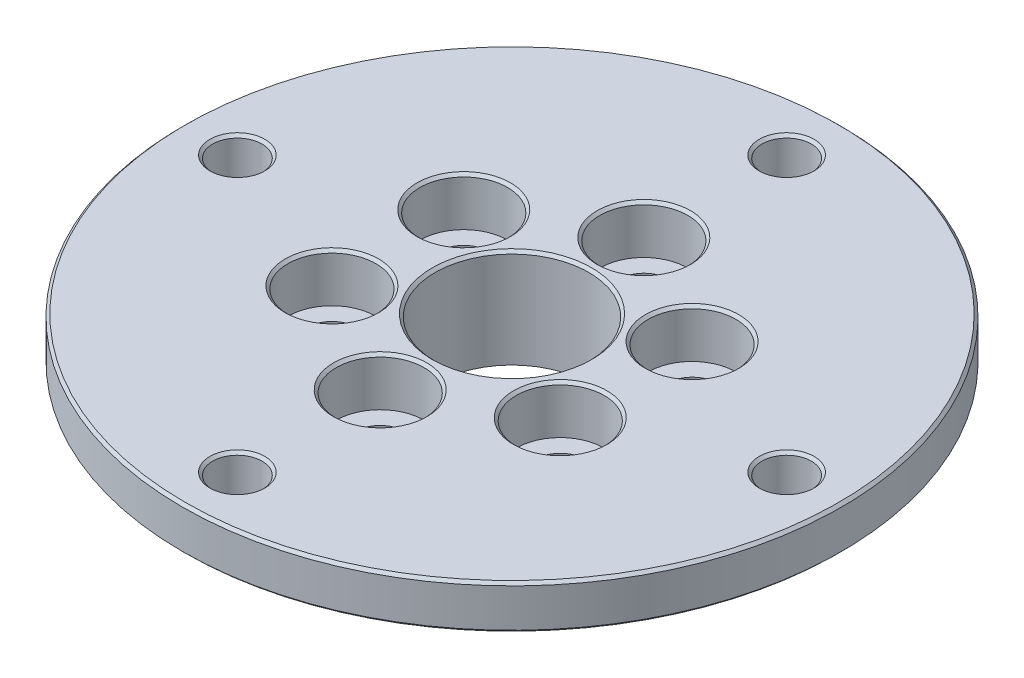
ISO-10303-21;
HEADER;
FILE_DESCRIPTION(('STEP AP214'),'2;1');
FILE_NAME('part.step','',(''),(''),'','','');
FILE_SCHEMA(('AUTOMOTIVE_DESIGN { 1 0 10303 214 1 1 1 1 }'));
ENDSEC;
DATA;
#1=APPLICATION_CONTEXT('core data for automotive mechanical design processes');
#2=APPLICATION_PROTOCOL_DEFINITION('international standard','automotive_design',2000,#1);
#3=PRODUCT_CONTEXT('',#1,'mechanical');
#4=PRODUCT('Part','Part','',(#3));
#5=PRODUCT_RELATED_PRODUCT_CATEGORY('part','',(#4));
#6=PRODUCT_DEFINITION_FORMATION('','',#4);
#7=PRODUCT_DEFINITION_CONTEXT('part definition',#1,'design');
#8=PRODUCT_DEFINITION('design','',#6,#7);
#9=PRODUCT_DEFINITION_SHAPE('','',#8);
#10=(LENGTH_UNIT() NAMED_UNIT(*) SI_UNIT(.MILLI.,.METRE.));
#11=(NAMED_UNIT(*) PLANE_ANGLE_UNIT() SI_UNIT($,.RADIAN.));
#12=(NAMED_UNIT(*) SI_UNIT($,.STERADIAN.) SOLID_ANGLE_UNIT());
#13=UNCERTAINTY_MEASURE_WITH_UNIT(LENGTH_MEASURE(1.E-05),#10,'distance_accuracy_value','');
#14=(GEOMETRIC_REPRESENTATION_CONTEXT(3) GLOBAL_UNCERTAINTY_ASSIGNED_CONTEXT((#13)) GLOBAL_UNIT_ASSIGNED_CONTEXT((#10,
#11,#12)) REPRESENTATION_CONTEXT('',''));
#15=CARTESIAN_POINT('',(0.,0.,0.));
#16=DIRECTION('',(0.,0.,1.));
#17=DIRECTION('',(1.,0.,0.));
#18=AXIS2_PLACEMENT_3D('',#15,#16,#17);
#19=CARTESIAN_POINT('',(0.,0.,0.));
#20=DIRECTION('',(0.,1.,0.));
#21=DIRECTION('',(0.,0.,1.));
#22=AXIS2_PLACEMENT_3D('',#19,#20,#21);
#23=PLANE('',#22);
#24=CARTESIAN_POINT('',(0.,0.,-12.));
#25=DIRECTION('',(0.,1.,0.));
#26=DIRECTION('',(0.,0.,1.));
#27=AXIS2_PLACEMENT_3D('',#24,#25,#26);
#28=CIRCLE('',#27,2.25);
#29=CARTESIAN_POINT('',(0.,0.,-9.75));
#30=VERTEX_POINT('',#29);
#31=EDGE_CURVE('E207',#30,#30,#28,.T.);
#32=ORIENTED_EDGE('',*,*,#31,.T.);
#33=EDGE_LOOP('',(#32));
#34=FACE_BOUND('',#33,.T.);
#35=CARTESIAN_POINT('',(10.3923048454133,0.,-5.99999999999998));
#36=DIRECTION('',(0.,1.,0.));
#37=DIRECTION('',(0.,0.,1.));
#38=AXIS2_PLACEMENT_3D('',#35,#36,#37);
#39=CIRCLE('',#38,2.25);
#40=CARTESIAN_POINT('',(10.3923048454133,0.,-3.74999999999998));
#41=VERTEX_POINT('',#40);
#42=EDGE_CURVE('E198',#41,#41,#39,.T.);
#43=ORIENTED_EDGE('',*,*,#42,.T.);
#44=EDGE_LOOP('',(#43));
#45=FACE_BOUND('',#44,.T.);
#46=CARTESIAN_POINT('',(10.3923048454132,0.,6.00000000000005));
#47=DIRECTION('',(0.,1.,0.));
#48=DIRECTION('',(0.,0.,1.));
#49=AXIS2_PLACEMENT_3D('',#46,#47,#48);
#50=CIRCLE('',#49,2.25);
#51=CARTESIAN_POINT('',(10.3923048454132,0.,8.25000000000005));
#52=VERTEX_POINT('',#51);
#53=EDGE_CURVE('E189',#52,#52,#50,.T.);
#54=ORIENTED_EDGE('',*,*,#53,.T.);
#55=EDGE_LOOP('',(#54));
#56=FACE_BOUND('',#55,.T.);
#57=CARTESIAN_POINT('',(0.,0.,12.));
#58=DIRECTION('',(0.,1.,0.));
#59=DIRECTION('',(0.,0.,1.));
#60=AXIS2_PLACEMENT_3D('',#57,#58,#59);
#61=CIRCLE('',#60,2.25);
#62=CARTESIAN_POINT('',(0.,0.,14.25));
#63=VERTEX_POINT('',#62);
#64=EDGE_CURVE('E180',#63,#63,#61,.T.);
#65=ORIENTED_EDGE('',*,*,#64,.T.);
#66=EDGE_LOOP('',(#65));
#67=FACE_BOUND('',#66,.T.);
#68=CARTESIAN_POINT('',(-10.3923048454133,0.,5.99999999999991));
#69=DIRECTION('',(0.,1.,0.));
#70=DIRECTION('',(0.,0.,1.));
#71=AXIS2_PLACEMENT_3D('',#68,#69,#70);
#72=CIRCLE('',#71,2.25);
#73=CARTESIAN_POINT('',(-10.3923048454133,0.,8.24999999999991));
#74=VERTEX_POINT('',#73);
#75=EDGE_CURVE('E171',#74,#74,#72,.T.);
#76=ORIENTED_EDGE('',*,*,#75,.T.);
#77=EDGE_LOOP('',(#76));
#78=FACE_BOUND('',#77,.T.);
#79=CARTESIAN_POINT('',(-10.3923048454132,0.,-6.00000000000012));
#80=DIRECTION('',(0.,1.,0.));
#81=DIRECTION('',(0.,0.,1.));
#82=AXIS2_PLACEMENT_3D('',#79,#80,#81);
#83=CIRCLE('',#82,2.25);
#84=CARTESIAN_POINT('',(-10.3923048454132,0.,-3.75000000000012));
#85=VERTEX_POINT('',#84);
#86=EDGE_CURVE('E162',#85,#85,#83,.T.);
#87=ORIENTED_EDGE('',*,*,#86,.T.);
#88=EDGE_LOOP('',(#87));
#89=FACE_BOUND('',#88,.T.);
#90=CARTESIAN_POINT('',(0.,0.,0.));
#91=DIRECTION('',(0.,1.,0.));
#92=DIRECTION('',(0.,0.,1.));
#93=AXIS2_PLACEMENT_3D('',#90,#91,#92);
#94=CIRCLE('',#93,20.5);
#95=CARTESIAN_POINT('',(0.,0.,20.5));
#96=VERTEX_POINT('',#95);
#97=EDGE_CURVE('E156',#96,#96,#94,.T.);
#98=ORIENTED_EDGE('',*,*,#97,.F.);
#99=EDGE_LOOP('',(#98));
#100=FACE_BOUND('',#99,.T.);
#101=CARTESIAN_POINT('',(0.,0.,0.));
#102=DIRECTION('',(0.,1.,0.));
#103=DIRECTION('',(0.,0.,1.));
#104=AXIS2_PLACEMENT_3D('',#101,#102,#103);
#105=CIRCLE('',#104,7.);
#106=CARTESIAN_POINT('',(0.,0.,7.));
#107=VERTEX_POINT('',#106);
#108=EDGE_CURVE('E159',#107,#107,#105,.T.);
#109=ORIENTED_EDGE('',*,*,#108,.T.);
#110=EDGE_LOOP('',(#109));
#111=FACE_BOUND('',#110,.T.);
#112=ADVANCED_FACE('F39',(#34,#45,#56,#67,#78,#89,#100,#111),#23,.F.);
#113=CARTESIAN_POINT('',(0.,5.,0.));
#114=DIRECTION('',(0.,-1.,0.));
#115=DIRECTION('',(0.,0.,-1.));
#116=AXIS2_PLACEMENT_3D('',#113,#114,#115);
#117=CYLINDRICAL_SURFACE('',#116,20.5);
#118=CARTESIAN_POINT('',(0.,4.75,0.));
#119=DIRECTION('',(0.,1.,0.));
#120=DIRECTION('',(0.,0.,1.));
#121=AXIS2_PLACEMENT_3D('',#118,#119,#120);
#122=CIRCLE('',#121,20.5);
#123=CARTESIAN_POINT('',(0.,4.75,20.5));
#124=VERTEX_POINT('',#123);
#125=EDGE_CURVE('E10',#124,#124,#122,.F.);
#126=ORIENTED_EDGE('',*,*,#125,.T.);
#127=EDGE_LOOP('',(#126));
#128=FACE_BOUND('',#127,.T.);
#129=ORIENTED_EDGE('',*,*,#97,.T.);
#130=EDGE_LOOP('',(#129));
#131=FACE_BOUND('',#130,.T.);
#132=ADVANCED_FACE('F236',(#128,#131),#117,.T.);
#133=CARTESIAN_POINT('',(0.,5.,0.));
#134=DIRECTION('',(0.,-1.,0.));
#135=DIRECTION('',(0.,0.,-1.));
#136=AXIS2_PLACEMENT_3D('',#133,#134,#135);
#137=CYLINDRICAL_SURFACE('',#136,7.);
#138=CARTESIAN_POINT('',(0.,8.74999999999998,0.));
#139=DIRECTION('',(0.,1.,0.));
#140=DIRECTION('',(0.,0.,1.));
#141=AXIS2_PLACEMENT_3D('',#138,#139,#140);
#142=CIRCLE('',#141,7.);
#143=CARTESIAN_POINT('',(0.,8.74999999999998,7.));
#144=VERTEX_POINT('',#143);
#145=EDGE_CURVE('E55',#144,#144,#142,.T.);
#146=ORIENTED_EDGE('',*,*,#145,.T.);
#147=EDGE_LOOP('',(#146));
#148=FACE_BOUND('',#147,.T.);
#149=ORIENTED_EDGE('',*,*,#108,.F.);
#150=EDGE_LOOP('',(#149));
#151=FACE_BOUND('',#150,.T.);
#152=ADVANCED_FACE('F243',(#148,#151),#137,.F.);
#153=CARTESIAN_POINT('',(0.,9.,0.));
#154=DIRECTION('',(0.,1.,0.));
#155=DIRECTION('',(0.,0.,1.));
#156=AXIS2_PLACEMENT_3D('',#153,#154,#155);
#157=PLANE('',#156);
#158=CARTESIAN_POINT('',(0.,9.,-12.));
#159=DIRECTION('',(0.,1.,0.));
#160=DIRECTION('',(0.,0.,1.));
#161=AXIS2_PLACEMENT_3D('',#158,#159,#160);
#162=CIRCLE('',#161,4.25000000000001);
#163=CARTESIAN_POINT('',(0.,9.,-7.74999999999999));
#164=VERTEX_POINT('',#163);
#165=EDGE_CURVE('E117',#164,#164,#162,.F.);
#166=ORIENTED_EDGE('',*,*,#165,.T.);
#167=EDGE_LOOP('',(#166));
#168=FACE_BOUND('',#167,.T.);
#169=CARTESIAN_POINT('',(10.3923048454133,9.,-5.99999999999998));
#170=DIRECTION('',(0.,1.,0.));
#171=DIRECTION('',(0.,0.,1.));
#172=AXIS2_PLACEMENT_3D('',#169,#170,#171);
#173=CIRCLE('',#172,4.25000000000001);
#174=CARTESIAN_POINT('',(10.3923048454133,9.,-1.74999999999996));
#175=VERTEX_POINT('',#174);
#176=EDGE_CURVE('E120',#175,#175,#173,.F.);
#177=ORIENTED_EDGE('',*,*,#176,.T.);
#178=EDGE_LOOP('',(#177));
#179=FACE_BOUND('',#178,.T.);
#180=CARTESIAN_POINT('',(10.3923048454132,9.,6.00000000000005));
#181=DIRECTION('',(0.,1.,0.));
#182=DIRECTION('',(0.,0.,1.));
#183=AXIS2_PLACEMENT_3D('',#180,#181,#182);
#184=CIRCLE('',#183,4.25000000000001);
#185=CARTESIAN_POINT('',(10.3923048454132,9.,10.2500000000001));
#186=VERTEX_POINT('',#185);
#187=EDGE_CURVE('E123',#186,#186,#184,.F.);
#188=ORIENTED_EDGE('',*,*,#187,.T.);
#189=EDGE_LOOP('',(#188));
#190=FACE_BOUND('',#189,.T.);
#191=CARTESIAN_POINT('',(0.,9.,12.));
#192=DIRECTION('',(0.,1.,0.));
#193=DIRECTION('',(0.,0.,1.));
#194=AXIS2_PLACEMENT_3D('',#191,#192,#193);
#195=CIRCLE('',#194,4.24999999999999);
#196=CARTESIAN_POINT('',(0.,9.,16.25));
#197=VERTEX_POINT('',#196);
#198=EDGE_CURVE('E126',#197,#197,#195,.F.);
#199=ORIENTED_EDGE('',*,*,#198,.T.);
#200=EDGE_LOOP('',(#199));
#201=FACE_BOUND('',#200,.T.);
#202=CARTESIAN_POINT('',(-10.3923048454133,9.,5.99999999999991));
#203=DIRECTION('',(0.,1.,0.));
#204=DIRECTION('',(0.,0.,1.));
#205=AXIS2_PLACEMENT_3D('',#202,#203,#204);
#206=CIRCLE('',#205,4.25);
#207=CARTESIAN_POINT('',(-10.3923048454133,9.,10.2499999999999));
#208=VERTEX_POINT('',#207);
#209=EDGE_CURVE('E129',#208,#208,#206,.F.);
#210=ORIENTED_EDGE('',*,*,#209,.T.);
#211=EDGE_LOOP('',(#210));
#212=FACE_BOUND('',#211,.T.);
#213=CARTESIAN_POINT('',(-10.3923048454132,9.,-6.00000000000012));
#214=DIRECTION('',(0.,1.,0.));
#215=DIRECTION('',(0.,0.,1.));
#216=AXIS2_PLACEMENT_3D('',#213,#214,#215);
#217=CIRCLE('',#216,4.25000000000001);
#218=CARTESIAN_POINT('',(-10.3923048454132,9.,-1.75000000000011));
#219=VERTEX_POINT('',#218);
#220=EDGE_CURVE('E132',#219,#219,#217,.F.);
#221=ORIENTED_EDGE('',*,*,#220,.T.);
#222=EDGE_LOOP('',(#221));
#223=FACE_BOUND('',#222,.T.);
#224=CARTESIAN_POINT('',(0.,9.,-25.));
#225=DIRECTION('',(0.,1.,0.));
#226=DIRECTION('',(0.,0.,1.));
#227=AXIS2_PLACEMENT_3D('',#224,#225,#226);
#228=CIRCLE('',#227,2.5);
#229=CARTESIAN_POINT('',(0.,9.,-22.5));
#230=VERTEX_POINT('',#229);
#231=EDGE_CURVE('E135',#230,#230,#228,.F.);
#232=ORIENTED_EDGE('',*,*,#231,.T.);
#233=EDGE_LOOP('',(#232));
#234=FACE_BOUND('',#233,.T.);
#235=CARTESIAN_POINT('',(25.,9.,0.));
#236=DIRECTION('',(0.,1.,0.));
#237=DIRECTION('',(0.,0.,1.));
#238=AXIS2_PLACEMENT_3D('',#235,#236,#237);
#239=CIRCLE('',#238,2.49999999999999);
#240=CARTESIAN_POINT('',(25.,9.,2.49999999999999));
#241=VERTEX_POINT('',#240);
#242=EDGE_CURVE('E138',#241,#241,#239,.F.);
#243=ORIENTED_EDGE('',*,*,#242,.T.);
#244=EDGE_LOOP('',(#243));
#245=FACE_BOUND('',#244,.T.);
#246=CARTESIAN_POINT('',(0.,9.,25.));
#247=DIRECTION('',(0.,1.,0.));
#248=DIRECTION('',(0.,0.,1.));
#249=AXIS2_PLACEMENT_3D('',#246,#247,#248);
#250=CIRCLE('',#249,2.5);
#251=CARTESIAN_POINT('',(0.,9.,27.5));
#252=VERTEX_POINT('',#251);
#253=EDGE_CURVE('E141',#252,#252,#250,.F.);
#254=ORIENTED_EDGE('',*,*,#253,.T.);
#255=EDGE_LOOP('',(#254));
#256=FACE_BOUND('',#255,.T.);
#257=CARTESIAN_POINT('',(-25.,9.,0.));
#258=DIRECTION('',(0.,1.,0.));
#259=DIRECTION('',(0.,0.,1.));
#260=AXIS2_PLACEMENT_3D('',#257,#258,#259);
#261=CIRCLE('',#260,2.49999999999999);
#262=CARTESIAN_POINT('',(-25.,9.,2.49999999999999));
#263=VERTEX_POINT('',#262);
#264=EDGE_CURVE('E144',#263,#263,#261,.F.);
#265=ORIENTED_EDGE('',*,*,#264,.T.);
#266=EDGE_LOOP('',(#265));
#267=FACE_BOUND('',#266,.T.);
#268=CARTESIAN_POINT('',(0.,9.,0.));
#269=DIRECTION('',(0.,1.,0.));
#270=DIRECTION('',(0.,0.,1.));
#271=AXIS2_PLACEMENT_3D('',#268,#269,#270);
#272=CIRCLE('',#271,7.25000000000001);
#273=CARTESIAN_POINT('',(0.,9.,7.25000000000001));
#274=VERTEX_POINT('',#273);
#275=EDGE_CURVE('E147',#274,#274,#272,.F.);
#276=ORIENTED_EDGE('',*,*,#275,.T.);
#277=EDGE_LOOP('',(#276));
#278=FACE_BOUND('',#277,.T.);
#279=CARTESIAN_POINT('',(0.,9.,0.));
#280=DIRECTION('',(0.,1.,0.));
#281=DIRECTION('',(0.,0.,1.));
#282=AXIS2_PLACEMENT_3D('',#279,#280,#281);
#283=CIRCLE('',#282,29.75);
#284=CARTESIAN_POINT('',(0.,9.,29.75));
#285=VERTEX_POINT('',#284);
#286=EDGE_CURVE('E150',#285,#285,#283,.T.);
#287=ORIENTED_EDGE('',*,*,#286,.T.);
#288=EDGE_LOOP('',(#287));
#289=FACE_BOUND('',#288,.T.);
#290=ADVANCED_FACE('F371',(#168,#179,#190,#201,#212,#223,#234,#245,#256,#267,#278,#289),#157,.T.);
#291=CARTESIAN_POINT('',(0.,5.,0.));
#292=DIRECTION('',(0.,1.,0.));
#293=DIRECTION('',(0.,0.,1.));
#294=AXIS2_PLACEMENT_3D('',#291,#292,#293);
#295=PLANE('',#294);
#296=CARTESIAN_POINT('',(0.,5.,-25.));
#297=DIRECTION('',(0.,1.,0.));
#298=DIRECTION('',(0.,0.,1.));
#299=AXIS2_PLACEMENT_3D('',#296,#297,#298);
#300=CIRCLE('',#299,2.50000000000001);
#301=CARTESIAN_POINT('',(0.,5.,-22.5));
#302=VERTEX_POINT('',#301);
#303=EDGE_CURVE('E78',#302,#302,#300,.T.);
#304=ORIENTED_EDGE('',*,*,#303,.T.);
#305=EDGE_LOOP('',(#304));
#306=FACE_BOUND('',#305,.T.);
#307=CARTESIAN_POINT('',(25.,5.,0.));
#308=DIRECTION('',(0.,1.,0.));
#309=DIRECTION('',(0.,0.,1.));
#310=AXIS2_PLACEMENT_3D('',#307,#308,#309);
#311=CIRCLE('',#310,2.50000000000001);
#312=CARTESIAN_POINT('',(25.,5.,2.50000000000001));
#313=VERTEX_POINT('',#312);
#314=EDGE_CURVE('E81',#313,#313,#311,.T.);
#315=ORIENTED_EDGE('',*,*,#314,.T.);
#316=EDGE_LOOP('',(#315));
#317=FACE_BOUND('',#316,.T.);
#318=CARTESIAN_POINT('',(0.,5.,25.));
#319=DIRECTION('',(0.,1.,0.));
#320=DIRECTION('',(0.,0.,1.));
#321=AXIS2_PLACEMENT_3D('',#318,#319,#320);
#322=CIRCLE('',#321,2.50000000000001);
#323=CARTESIAN_POINT('',(0.,5.,27.5));
#324=VERTEX_POINT('',#323);
#325=EDGE_CURVE('E84',#324,#324,#322,.T.);
#326=ORIENTED_EDGE('',*,*,#325,.T.);
#327=EDGE_LOOP('',(#326));
#328=FACE_BOUND('',#327,.T.);
#329=CARTESIAN_POINT('',(-25.,5.,0.));
#330=DIRECTION('',(0.,1.,0.));
#331=DIRECTION('',(0.,0.,1.));
#332=AXIS2_PLACEMENT_3D('',#329,#330,#331);
#333=CIRCLE('',#332,2.50000000000001);
#334=CARTESIAN_POINT('',(-25.,5.,2.50000000000001));
#335=VERTEX_POINT('',#334);
#336=EDGE_CURVE('E87',#335,#335,#333,.T.);
#337=ORIENTED_EDGE('',*,*,#336,.T.);
#338=EDGE_LOOP('',(#337));
#339=FACE_BOUND('',#338,.T.);
#340=CARTESIAN_POINT('',(0.,5.,0.));
#341=DIRECTION('',(0.,1.,0.));
#342=DIRECTION('',(0.,0.,1.));
#343=AXIS2_PLACEMENT_3D('',#340,#341,#342);
#344=CIRCLE('',#343,29.75);
#345=CARTESIAN_POINT('',(0.,5.,29.75));
#346=VERTEX_POINT('',#345);
#347=EDGE_CURVE('E90',#346,#346,#344,.F.);
#348=ORIENTED_EDGE('',*,*,#347,.T.);
#349=EDGE_LOOP('',(#348));
#350=FACE_BOUND('',#349,.T.);
#351=CARTESIAN_POINT('',(0.,5.,0.));
#352=DIRECTION('',(0.,1.,0.));
#353=DIRECTION('',(0.,0.,1.));
#354=AXIS2_PLACEMENT_3D('',#351,#352,#353);
#355=CIRCLE('',#354,20.75);
#356=CARTESIAN_POINT('',(0.,5.,20.75));
#357=VERTEX_POINT('',#356);
#358=EDGE_CURVE('E93',#357,#357,#355,.T.);
#359=ORIENTED_EDGE('',*,*,#358,.T.);
#360=EDGE_LOOP('',(#359));
#361=FACE_BOUND('',#360,.T.);
#362=ADVANCED_FACE('F368',(#306,#317,#328,#339,#350,#361),#295,.F.);
#363=CARTESIAN_POINT('',(0.,9.,0.));
#364=DIRECTION('',(0.,-1.,0.));
#365=DIRECTION('',(0.,0.,-1.));
#366=AXIS2_PLACEMENT_3D('',#363,#364,#365);
#367=CYLINDRICAL_SURFACE('',#366,30.);
#368=CARTESIAN_POINT('',(0.,5.25,0.));
#369=DIRECTION('',(0.,1.,0.));
#370=DIRECTION('',(0.,0.,1.));
#371=AXIS2_PLACEMENT_3D('',#368,#369,#370);
#372=CIRCLE('',#371,30.);
#373=CARTESIAN_POINT('',(0.,5.25,30.));
#374=VERTEX_POINT('',#373);
#375=EDGE_CURVE('E47',#374,#374,#372,.T.);
#376=ORIENTED_EDGE('',*,*,#375,.T.);
#377=EDGE_LOOP('',(#376));
#378=FACE_BOUND('',#377,.T.);
#379=CARTESIAN_POINT('',(0.,8.75,0.));
#380=DIRECTION('',(0.,1.,0.));
#381=DIRECTION('',(0.,0.,1.));
#382=AXIS2_PLACEMENT_3D('',#379,#380,#381);
#383=CIRCLE('',#382,30.);
#384=CARTESIAN_POINT('',(0.,8.75,30.));
#385=VERTEX_POINT('',#384);
#386=EDGE_CURVE('E51',#385,#385,#383,.F.);
#387=ORIENTED_EDGE('',*,*,#386,.T.);
#388=EDGE_LOOP('',(#387));
#389=FACE_BOUND('',#388,.T.);
#390=ADVANCED_FACE('F370',(#378,#389),#367,.T.);
#391=CARTESIAN_POINT('',(-25.,5.,0.));
#392=DIRECTION('',(0.,-1.,0.));
#393=DIRECTION('',(0.,0.,-1.));
#394=AXIS2_PLACEMENT_3D('',#391,#392,#393);
#395=CYLINDRICAL_SURFACE('',#394,2.25);
#396=CARTESIAN_POINT('',(-25.,5.25,0.));
#397=DIRECTION('',(0.,1.,0.));
#398=DIRECTION('',(0.,0.,1.));
#399=AXIS2_PLACEMENT_3D('',#396,#397,#398);
#400=CIRCLE('',#399,2.25);
#401=CARTESIAN_POINT('',(-25.,5.25,2.25));
#402=VERTEX_POINT('',#401);
#403=EDGE_CURVE('E60',#402,#402,#400,.F.);
#404=ORIENTED_EDGE('',*,*,#403,.T.);
#405=EDGE_LOOP('',(#404));
#406=FACE_BOUND('',#405,.T.);
#407=CARTESIAN_POINT('',(-25.,8.75000000000001,0.));
#408=DIRECTION('',(0.,1.,0.));
#409=DIRECTION('',(0.,0.,1.));
#410=AXIS2_PLACEMENT_3D('',#407,#408,#409);
#411=CIRCLE('',#410,2.25);
#412=CARTESIAN_POINT('',(-25.,8.75000000000001,2.25));
#413=VERTEX_POINT('',#412);
#414=EDGE_CURVE('E63',#413,#413,#411,.T.);
#415=ORIENTED_EDGE('',*,*,#414,.T.);
#416=EDGE_LOOP('',(#415));
#417=FACE_BOUND('',#416,.T.);
#418=ADVANCED_FACE('F378',(#406,#417),#395,.F.);
#419=CARTESIAN_POINT('',(0.,5.,25.));
#420=DIRECTION('',(0.,-1.,0.));
#421=DIRECTION('',(0.,0.,-1.));
#422=AXIS2_PLACEMENT_3D('',#419,#420,#421);
#423=CYLINDRICAL_SURFACE('',#422,2.25);
#424=CARTESIAN_POINT('',(0.,5.25,25.));
#425=DIRECTION('',(0.,1.,0.));
#426=DIRECTION('',(0.,0.,1.));
#427=AXIS2_PLACEMENT_3D('',#424,#425,#426);
#428=CIRCLE('',#427,2.25);
#429=CARTESIAN_POINT('',(0.,5.25,27.25));
#430=VERTEX_POINT('',#429);
#431=EDGE_CURVE('E66',#430,#430,#428,.F.);
#432=ORIENTED_EDGE('',*,*,#431,.T.);
#433=EDGE_LOOP('',(#432));
#434=FACE_BOUND('',#433,.T.);
#435=CARTESIAN_POINT('',(0.,8.75,25.));
#436=DIRECTION('',(0.,1.,0.));
#437=DIRECTION('',(0.,0.,1.));
#438=AXIS2_PLACEMENT_3D('',#435,#436,#437);
#439=CIRCLE('',#438,2.25);
#440=CARTESIAN_POINT('',(0.,8.75,27.25));
#441=VERTEX_POINT('',#440);
#442=EDGE_CURVE('E69',#441,#441,#439,.T.);
#443=ORIENTED_EDGE('',*,*,#442,.T.);
#444=EDGE_LOOP('',(#443));
#445=FACE_BOUND('',#444,.T.);
#446=ADVANCED_FACE('F385',(#434,#445),#423,.F.);
#447=CARTESIAN_POINT('',(25.,5.,0.));
#448=DIRECTION('',(0.,-1.,0.));
#449=DIRECTION('',(0.,0.,-1.));
#450=AXIS2_PLACEMENT_3D('',#447,#448,#449);
#451=CYLINDRICAL_SURFACE('',#450,2.25);
#452=CARTESIAN_POINT('',(25.,5.25,0.));
#453=DIRECTION('',(0.,1.,0.));
#454=DIRECTION('',(0.,0.,1.));
#455=AXIS2_PLACEMENT_3D('',#452,#453,#454);
#456=CIRCLE('',#455,2.25);
#457=CARTESIAN_POINT('',(25.,5.25,2.25));
#458=VERTEX_POINT('',#457);
#459=EDGE_CURVE('E72',#458,#458,#456,.F.);
#460=ORIENTED_EDGE('',*,*,#459,.T.);
#461=EDGE_LOOP('',(#460));
#462=FACE_BOUND('',#461,.T.);
#463=CARTESIAN_POINT('',(25.,8.75000000000001,0.));
#464=DIRECTION('',(0.,1.,0.));
#465=DIRECTION('',(0.,0.,1.));
#466=AXIS2_PLACEMENT_3D('',#463,#464,#465);
#467=CIRCLE('',#466,2.25);
#468=CARTESIAN_POINT('',(25.,8.75000000000001,2.25));
#469=VERTEX_POINT('',#468);
#470=EDGE_CURVE('E75',#469,#469,#467,.T.);
#471=ORIENTED_EDGE('',*,*,#470,.T.);
#472=EDGE_LOOP('',(#471));
#473=FACE_BOUND('',#472,.T.);
#474=ADVANCED_FACE('F389',(#462,#473),#451,.F.);
#475=CARTESIAN_POINT('',(0.,5.,-25.));
#476=DIRECTION('',(0.,-1.,0.));
#477=DIRECTION('',(0.,0.,-1.));
#478=AXIS2_PLACEMENT_3D('',#475,#476,#477);
#479=CYLINDRICAL_SURFACE('',#478,2.25);
#480=CARTESIAN_POINT('',(0.,5.25,-25.));
#481=DIRECTION('',(0.,1.,0.));
#482=DIRECTION('',(0.,0.,1.));
#483=AXIS2_PLACEMENT_3D('',#480,#481,#482);
#484=CIRCLE('',#483,2.25);
#485=CARTESIAN_POINT('',(0.,5.25,-22.75));
#486=VERTEX_POINT('',#485);
#487=EDGE_CURVE('E96',#486,#486,#484,.F.);
#488=ORIENTED_EDGE('',*,*,#487,.T.);
#489=EDGE_LOOP('',(#488));
#490=FACE_BOUND('',#489,.T.);
#491=CARTESIAN_POINT('',(0.,8.75,-25.));
#492=DIRECTION('',(0.,1.,0.));
#493=DIRECTION('',(0.,0.,1.));
#494=AXIS2_PLACEMENT_3D('',#491,#492,#493);
#495=CIRCLE('',#494,2.25);
#496=CARTESIAN_POINT('',(0.,8.75,-22.75));
#497=VERTEX_POINT('',#496);
#498=EDGE_CURVE('E99',#497,#497,#495,.T.);
#499=ORIENTED_EDGE('',*,*,#498,.T.);
#500=EDGE_LOOP('',(#499));
#501=FACE_BOUND('',#500,.T.);
#502=ADVANCED_FACE('F393',(#490,#501),#479,.F.);
#503=CARTESIAN_POINT('',(-10.3923048454132,9.,-6.00000000000012));
#504=DIRECTION('',(0.,1.,0.));
#505=DIRECTION('',(0.,0.,1.));
#506=AXIS2_PLACEMENT_3D('',#503,#504,#505);
#507=CYLINDRICAL_SURFACE('',#506,2.25);
#508=ORIENTED_EDGE('',*,*,#86,.F.);
#509=EDGE_LOOP('',(#508));
#510=FACE_BOUND('',#509,.T.);
#511=CARTESIAN_POINT('',(-10.3923048454132,4.6,-6.00000000000012));
#512=DIRECTION('',(0.,1.,0.));
#513=DIRECTION('',(0.,0.,1.));
#514=AXIS2_PLACEMENT_3D('',#511,#512,#513);
#515=CIRCLE('',#514,2.25);
#516=CARTESIAN_POINT('',(-10.3923048454132,4.6,-3.75000000000012));
#517=VERTEX_POINT('',#516);
#518=EDGE_CURVE('E165',#517,#517,#515,.T.);
#519=ORIENTED_EDGE('',*,*,#518,.T.);
#520=EDGE_LOOP('',(#519));
#521=FACE_BOUND('',#520,.T.);
#522=ADVANCED_FACE('F397',(#510,#521),#507,.F.);
#523=CARTESIAN_POINT('',(-8.14230484541319,4.6,-6.00000000000012));
#524=DIRECTION('',(0.,-1.,0.));
#525=DIRECTION('',(0.,0.,-1.));
#526=AXIS2_PLACEMENT_3D('',#523,#524,#525);
#527=PLANE('',#526);
#528=ORIENTED_EDGE('',*,*,#518,.F.);
#529=EDGE_LOOP('',(#528));
#530=FACE_BOUND('',#529,.T.);
#531=CARTESIAN_POINT('',(-10.3923048454132,4.6,-6.00000000000012));
#532=DIRECTION('',(0.,1.,0.));
#533=DIRECTION('',(0.,0.,1.));
#534=AXIS2_PLACEMENT_3D('',#531,#532,#533);
#535=CIRCLE('',#534,4.);
#536=CARTESIAN_POINT('',(-10.3923048454132,4.6,-2.00000000000012));
#537=VERTEX_POINT('',#536);
#538=EDGE_CURVE('E168',#537,#537,#535,.T.);
#539=ORIENTED_EDGE('',*,*,#538,.T.);
#540=EDGE_LOOP('',(#539));
#541=FACE_BOUND('',#540,.T.);
#542=ADVANCED_FACE('F400',(#530,#541),#527,.F.);
#543=CARTESIAN_POINT('',(-10.3923048454132,9.,-6.00000000000012));
#544=DIRECTION('',(0.,1.,0.));
#545=DIRECTION('',(0.,0.,1.));
#546=AXIS2_PLACEMENT_3D('',#543,#544,#545);
#547=CYLINDRICAL_SURFACE('',#546,4.);
#548=CARTESIAN_POINT('',(-10.3923048454132,8.74999999999999,-6.00000000000012));
#549=DIRECTION('',(0.,1.,0.));
#550=DIRECTION('',(0.,0.,1.));
#551=AXIS2_PLACEMENT_3D('',#548,#549,#550);
#552=CIRCLE('',#551,4.);
#553=CARTESIAN_POINT('',(-10.3923048454132,8.74999999999999,-2.00000000000012));
#554=VERTEX_POINT('',#553);
#555=EDGE_CURVE('E102',#554,#554,#552,.T.);
#556=ORIENTED_EDGE('',*,*,#555,.T.);
#557=EDGE_LOOP('',(#556));
#558=FACE_BOUND('',#557,.T.);
#559=ORIENTED_EDGE('',*,*,#538,.F.);
#560=EDGE_LOOP('',(#559));
#561=FACE_BOUND('',#560,.T.);
#562=ADVANCED_FACE('F404',(#558,#561),#547,.F.);
#563=CARTESIAN_POINT('',(-10.3923048454133,9.,5.99999999999991));
#564=DIRECTION('',(0.,1.,0.));
#565=DIRECTION('',(0.,0.,1.));
#566=AXIS2_PLACEMENT_3D('',#563,#564,#565);
#567=CYLINDRICAL_SURFACE('',#566,2.25);
#568=ORIENTED_EDGE('',*,*,#75,.F.);
#569=EDGE_LOOP('',(#568));
#570=FACE_BOUND('',#569,.T.);
#571=CARTESIAN_POINT('',(-10.3923048454133,4.6,5.99999999999991));
#572=DIRECTION('',(0.,1.,0.));
#573=DIRECTION('',(0.,0.,1.));
#574=AXIS2_PLACEMENT_3D('',#571,#572,#573);
#575=CIRCLE('',#574,2.25);
#576=CARTESIAN_POINT('',(-10.3923048454133,4.6,8.24999999999991));
#577=VERTEX_POINT('',#576);
#578=EDGE_CURVE('E174',#577,#577,#575,.T.);
#579=ORIENTED_EDGE('',*,*,#578,.T.);
#580=EDGE_LOOP('',(#579));
#581=FACE_BOUND('',#580,.T.);
#582=ADVANCED_FACE('F408',(#570,#581),#567,.F.);
#583=CARTESIAN_POINT('',(-8.14230484541332,4.6,5.99999999999991));
#584=DIRECTION('',(0.,-1.,0.));
#585=DIRECTION('',(0.,0.,-1.));
#586=AXIS2_PLACEMENT_3D('',#583,#584,#585);
#587=PLANE('',#586);
#588=ORIENTED_EDGE('',*,*,#578,.F.);
#589=EDGE_LOOP('',(#588));
#590=FACE_BOUND('',#589,.T.);
#591=CARTESIAN_POINT('',(-10.3923048454133,4.6,5.99999999999991));
#592=DIRECTION('',(0.,1.,0.));
#593=DIRECTION('',(0.,0.,1.));
#594=AXIS2_PLACEMENT_3D('',#591,#592,#593);
#595=CIRCLE('',#594,4.);
#596=CARTESIAN_POINT('',(-10.3923048454133,4.6,9.99999999999991));
#597=VERTEX_POINT('',#596);
#598=EDGE_CURVE('E177',#597,#597,#595,.T.);
#599=ORIENTED_EDGE('',*,*,#598,.T.);
#600=EDGE_LOOP('',(#599));
#601=FACE_BOUND('',#600,.T.);
#602=ADVANCED_FACE('F412',(#590,#601),#587,.F.);
#603=CARTESIAN_POINT('',(-10.3923048454133,9.,5.99999999999991));
#604=DIRECTION('',(0.,1.,0.));
#605=DIRECTION('',(0.,0.,1.));
#606=AXIS2_PLACEMENT_3D('',#603,#604,#605);
#607=CYLINDRICAL_SURFACE('',#606,4.);
#608=CARTESIAN_POINT('',(-10.3923048454133,8.75,5.99999999999991));
#609=DIRECTION('',(0.,1.,0.));
#610=DIRECTION('',(0.,0.,1.));
#611=AXIS2_PLACEMENT_3D('',#608,#609,#610);
#612=CIRCLE('',#611,4.);
#613=CARTESIAN_POINT('',(-10.3923048454133,8.75,9.9999999999999));
#614=VERTEX_POINT('',#613);
#615=EDGE_CURVE('E105',#614,#614,#612,.T.);
#616=ORIENTED_EDGE('',*,*,#615,.T.);
#617=EDGE_LOOP('',(#616));
#618=FACE_BOUND('',#617,.T.);
#619=ORIENTED_EDGE('',*,*,#598,.F.);
#620=EDGE_LOOP('',(#619));
#621=FACE_BOUND('',#620,.T.);
#622=ADVANCED_FACE('F416',(#618,#621),#607,.F.);
#623=CARTESIAN_POINT('',(0.,9.,12.));
#624=DIRECTION('',(0.,1.,0.));
#625=DIRECTION('',(0.,0.,1.));
#626=AXIS2_PLACEMENT_3D('',#623,#624,#625);
#627=CYLINDRICAL_SURFACE('',#626,2.25);
#628=ORIENTED_EDGE('',*,*,#64,.F.);
#629=EDGE_LOOP('',(#628));
#630=FACE_BOUND('',#629,.T.);
#631=CARTESIAN_POINT('',(0.,4.6,12.));
#632=DIRECTION('',(0.,1.,0.));
#633=DIRECTION('',(0.,0.,1.));
#634=AXIS2_PLACEMENT_3D('',#631,#632,#633);
#635=CIRCLE('',#634,2.25);
#636=CARTESIAN_POINT('',(0.,4.6,14.25));
#637=VERTEX_POINT('',#636);
#638=EDGE_CURVE('E183',#637,#637,#635,.T.);
#639=ORIENTED_EDGE('',*,*,#638,.T.);
#640=EDGE_LOOP('',(#639));
#641=FACE_BOUND('',#640,.T.);
#642=ADVANCED_FACE('F420',(#630,#641),#627,.F.);
#643=CARTESIAN_POINT('',(2.24999999999992,4.6,12.));
#644=DIRECTION('',(0.,-1.,0.));
#645=DIRECTION('',(0.,0.,-1.));
#646=AXIS2_PLACEMENT_3D('',#643,#644,#645);
#647=PLANE('',#646);
#648=ORIENTED_EDGE('',*,*,#638,.F.);
#649=EDGE_LOOP('',(#648));
#650=FACE_BOUND('',#649,.T.);
#651=CARTESIAN_POINT('',(0.,4.6,12.));
#652=DIRECTION('',(0.,1.,0.));
#653=DIRECTION('',(0.,0.,1.));
#654=AXIS2_PLACEMENT_3D('',#651,#652,#653);
#655=CIRCLE('',#654,4.);
#656=CARTESIAN_POINT('',(0.,4.6,16.));
#657=VERTEX_POINT('',#656);
#658=EDGE_CURVE('E186',#657,#657,#655,.T.);
#659=ORIENTED_EDGE('',*,*,#658,.T.);
#660=EDGE_LOOP('',(#659));
#661=FACE_BOUND('',#660,.T.);
#662=ADVANCED_FACE('F424',(#650,#661),#647,.F.);
#663=CARTESIAN_POINT('',(0.,9.,12.));
#664=DIRECTION('',(0.,1.,0.));
#665=DIRECTION('',(0.,0.,1.));
#666=AXIS2_PLACEMENT_3D('',#663,#664,#665);
#667=CYLINDRICAL_SURFACE('',#666,4.);
#668=CARTESIAN_POINT('',(0.,8.75,12.));
#669=DIRECTION('',(0.,1.,0.));
#670=DIRECTION('',(0.,0.,1.));
#671=AXIS2_PLACEMENT_3D('',#668,#669,#670);
#672=CIRCLE('',#671,4.);
#673=CARTESIAN_POINT('',(0.,8.75,16.));
#674=VERTEX_POINT('',#673);
#675=EDGE_CURVE('E108',#674,#674,#672,.T.);
#676=ORIENTED_EDGE('',*,*,#675,.T.);
#677=EDGE_LOOP('',(#676));
#678=FACE_BOUND('',#677,.T.);
#679=ORIENTED_EDGE('',*,*,#658,.F.);
#680=EDGE_LOOP('',(#679));
#681=FACE_BOUND('',#680,.T.);
#682=ADVANCED_FACE('F428',(#678,#681),#667,.F.);
#683=CARTESIAN_POINT('',(10.3923048454132,9.,6.00000000000005));
#684=DIRECTION('',(0.,1.,0.));
#685=DIRECTION('',(0.,0.,1.));
#686=AXIS2_PLACEMENT_3D('',#683,#684,#685);
#687=CYLINDRICAL_SURFACE('',#686,2.25);
#688=ORIENTED_EDGE('',*,*,#53,.F.);
#689=EDGE_LOOP('',(#688));
#690=FACE_BOUND('',#689,.T.);
#691=CARTESIAN_POINT('',(10.3923048454132,4.6,6.00000000000005));
#692=DIRECTION('',(0.,1.,0.));
#693=DIRECTION('',(0.,0.,1.));
#694=AXIS2_PLACEMENT_3D('',#691,#692,#693);
#695=CIRCLE('',#694,2.25);
#696=CARTESIAN_POINT('',(10.3923048454132,4.6,8.25000000000005));
#697=VERTEX_POINT('',#696);
#698=EDGE_CURVE('E192',#697,#697,#695,.T.);
#699=ORIENTED_EDGE('',*,*,#698,.T.);
#700=EDGE_LOOP('',(#699));
#701=FACE_BOUND('',#700,.T.);
#702=ADVANCED_FACE('F432',(#690,#701),#687,.F.);
#703=CARTESIAN_POINT('',(12.6423048454132,4.6,6.00000000000005));
#704=DIRECTION('',(0.,-1.,0.));
#705=DIRECTION('',(0.,0.,-1.));
#706=AXIS2_PLACEMENT_3D('',#703,#704,#705);
#707=PLANE('',#706);
#708=ORIENTED_EDGE('',*,*,#698,.F.);
#709=EDGE_LOOP('',(#708));
#710=FACE_BOUND('',#709,.T.);
#711=CARTESIAN_POINT('',(10.3923048454132,4.6,6.00000000000005));
#712=DIRECTION('',(0.,1.,0.));
#713=DIRECTION('',(0.,0.,1.));
#714=AXIS2_PLACEMENT_3D('',#711,#712,#713);
#715=CIRCLE('',#714,4.);
#716=CARTESIAN_POINT('',(10.3923048454132,4.6,10.));
#717=VERTEX_POINT('',#716);
#718=EDGE_CURVE('E195',#717,#717,#715,.T.);
#719=ORIENTED_EDGE('',*,*,#718,.T.);
#720=EDGE_LOOP('',(#719));
#721=FACE_BOUND('',#720,.T.);
#722=ADVANCED_FACE('F436',(#710,#721),#707,.F.);
#723=CARTESIAN_POINT('',(10.3923048454132,9.,6.00000000000005));
#724=DIRECTION('',(0.,1.,0.));
#725=DIRECTION('',(0.,0.,1.));
#726=AXIS2_PLACEMENT_3D('',#723,#724,#725);
#727=CYLINDRICAL_SURFACE('',#726,4.);
#728=CARTESIAN_POINT('',(10.3923048454132,8.74999999999999,6.00000000000005));
#729=DIRECTION('',(0.,1.,0.));
#730=DIRECTION('',(0.,0.,1.));
#731=AXIS2_PLACEMENT_3D('',#728,#729,#730);
#732=CIRCLE('',#731,4.);
#733=CARTESIAN_POINT('',(10.3923048454132,8.74999999999999,10.));
#734=VERTEX_POINT('',#733);
#735=EDGE_CURVE('E111',#734,#734,#732,.T.);
#736=ORIENTED_EDGE('',*,*,#735,.T.);
#737=EDGE_LOOP('',(#736));
#738=FACE_BOUND('',#737,.T.);
#739=ORIENTED_EDGE('',*,*,#718,.F.);
#740=EDGE_LOOP('',(#739));
#741=FACE_BOUND('',#740,.T.);
#742=ADVANCED_FACE('F440',(#738,#741),#727,.F.);
#743=CARTESIAN_POINT('',(10.3923048454133,9.,-5.99999999999998));
#744=DIRECTION('',(0.,1.,0.));
#745=DIRECTION('',(0.,0.,1.));
#746=AXIS2_PLACEMENT_3D('',#743,#744,#745);
#747=CYLINDRICAL_SURFACE('',#746,2.25);
#748=ORIENTED_EDGE('',*,*,#42,.F.);
#749=EDGE_LOOP('',(#748));
#750=FACE_BOUND('',#749,.T.);
#751=CARTESIAN_POINT('',(10.3923048454133,4.6,-5.99999999999998));
#752=DIRECTION('',(0.,1.,0.));
#753=DIRECTION('',(0.,0.,1.));
#754=AXIS2_PLACEMENT_3D('',#751,#752,#753);
#755=CIRCLE('',#754,2.25);
#756=CARTESIAN_POINT('',(10.3923048454133,4.6,-3.74999999999997));
#757=VERTEX_POINT('',#756);
#758=EDGE_CURVE('E201',#757,#757,#755,.T.);
#759=ORIENTED_EDGE('',*,*,#758,.T.);
#760=EDGE_LOOP('',(#759));
#761=FACE_BOUND('',#760,.T.);
#762=ADVANCED_FACE('F444',(#750,#761),#747,.F.);
#763=CARTESIAN_POINT('',(12.6423048454133,4.6,-5.99999999999998));
#764=DIRECTION('',(0.,-1.,0.));
#765=DIRECTION('',(0.,0.,-1.));
#766=AXIS2_PLACEMENT_3D('',#763,#764,#765);
#767=PLANE('',#766);
#768=ORIENTED_EDGE('',*,*,#758,.F.);
#769=EDGE_LOOP('',(#768));
#770=FACE_BOUND('',#769,.T.);
#771=CARTESIAN_POINT('',(10.3923048454133,4.6,-5.99999999999998));
#772=DIRECTION('',(0.,1.,0.));
#773=DIRECTION('',(0.,0.,1.));
#774=AXIS2_PLACEMENT_3D('',#771,#772,#773);
#775=CIRCLE('',#774,4.);
#776=CARTESIAN_POINT('',(10.3923048454133,4.6,-1.99999999999997));
#777=VERTEX_POINT('',#776);
#778=EDGE_CURVE('E204',#777,#777,#775,.T.);
#779=ORIENTED_EDGE('',*,*,#778,.T.);
#780=EDGE_LOOP('',(#779));
#781=FACE_BOUND('',#780,.T.);
#782=ADVANCED_FACE('F448',(#770,#781),#767,.F.);
#783=CARTESIAN_POINT('',(10.3923048454133,9.,-5.99999999999998));
#784=DIRECTION('',(0.,1.,0.));
#785=DIRECTION('',(0.,0.,1.));
#786=AXIS2_PLACEMENT_3D('',#783,#784,#785);
#787=CYLINDRICAL_SURFACE('',#786,4.);
#788=CARTESIAN_POINT('',(10.3923048454133,8.74999999999999,-5.99999999999998));
#789=DIRECTION('',(0.,1.,0.));
#790=DIRECTION('',(0.,0.,1.));
#791=AXIS2_PLACEMENT_3D('',#788,#789,#790);
#792=CIRCLE('',#791,4.);
#793=CARTESIAN_POINT('',(10.3923048454133,8.74999999999999,-1.99999999999998));
#794=VERTEX_POINT('',#793);
#795=EDGE_CURVE('E114',#794,#794,#792,.T.);
#796=ORIENTED_EDGE('',*,*,#795,.T.);
#797=EDGE_LOOP('',(#796));
#798=FACE_BOUND('',#797,.T.);
#799=ORIENTED_EDGE('',*,*,#778,.F.);
#800=EDGE_LOOP('',(#799));
#801=FACE_BOUND('',#800,.T.);
#802=ADVANCED_FACE('F452',(#798,#801),#787,.F.);
#803=CARTESIAN_POINT('',(0.,9.,-12.));
#804=DIRECTION('',(0.,1.,0.));
#805=DIRECTION('',(0.,0.,1.));
#806=AXIS2_PLACEMENT_3D('',#803,#804,#805);
#807=CYLINDRICAL_SURFACE('',#806,2.25);
#808=ORIENTED_EDGE('',*,*,#31,.F.);
#809=EDGE_LOOP('',(#808));
#810=FACE_BOUND('',#809,.T.);
#811=CARTESIAN_POINT('',(0.,4.6,-12.));
#812=DIRECTION('',(0.,1.,0.));
#813=DIRECTION('',(0.,0.,1.));
#814=AXIS2_PLACEMENT_3D('',#811,#812,#813);
#815=CIRCLE('',#814,2.25);
#816=CARTESIAN_POINT('',(0.,4.6,-9.75));
#817=VERTEX_POINT('',#816);
#818=EDGE_CURVE('E210',#817,#817,#815,.T.);
#819=ORIENTED_EDGE('',*,*,#818,.T.);
#820=EDGE_LOOP('',(#819));
#821=FACE_BOUND('',#820,.T.);
#822=ADVANCED_FACE('F232',(#810,#821),#807,.F.);
#823=CARTESIAN_POINT('',(2.25,4.6,-12.));
#824=DIRECTION('',(0.,-1.,0.));
#825=DIRECTION('',(0.,0.,-1.));
#826=AXIS2_PLACEMENT_3D('',#823,#824,#825);
#827=PLANE('',#826);
#828=ORIENTED_EDGE('',*,*,#818,.F.);
#829=EDGE_LOOP('',(#828));
#830=FACE_BOUND('',#829,.T.);
#831=CARTESIAN_POINT('',(0.,4.6,-12.));
#832=DIRECTION('',(0.,1.,0.));
#833=DIRECTION('',(0.,0.,1.));
#834=AXIS2_PLACEMENT_3D('',#831,#832,#833);
#835=CIRCLE('',#834,4.);
#836=CARTESIAN_POINT('',(0.,4.6,-8.));
#837=VERTEX_POINT('',#836);
#838=EDGE_CURVE('E213',#837,#837,#835,.T.);
#839=ORIENTED_EDGE('',*,*,#838,.T.);
#840=EDGE_LOOP('',(#839));
#841=FACE_BOUND('',#840,.T.);
#842=ADVANCED_FACE('F217',(#830,#841),#827,.F.);
#843=CARTESIAN_POINT('',(0.,9.,-12.));
#844=DIRECTION('',(0.,1.,0.));
#845=DIRECTION('',(0.,0.,1.));
#846=AXIS2_PLACEMENT_3D('',#843,#844,#845);
#847=CYLINDRICAL_SURFACE('',#846,4.);
#848=CARTESIAN_POINT('',(0.,8.74999999999999,-12.));
#849=DIRECTION('',(0.,1.,0.));
#850=DIRECTION('',(0.,0.,1.));
#851=AXIS2_PLACEMENT_3D('',#848,#849,#850);
#852=CIRCLE('',#851,4.);
#853=CARTESIAN_POINT('',(0.,8.74999999999999,-8.));
#854=VERTEX_POINT('',#853);
#855=EDGE_CURVE('E153',#854,#854,#852,.T.);
#856=ORIENTED_EDGE('',*,*,#855,.T.);
#857=EDGE_LOOP('',(#856));
#858=FACE_BOUND('',#857,.T.);
#859=ORIENTED_EDGE('',*,*,#838,.F.);
#860=EDGE_LOOP('',(#859));
#861=FACE_BOUND('',#860,.T.);
#862=ADVANCED_FACE('F219',(#858,#861),#847,.F.);
#863=CARTESIAN_POINT('',(0.,8.74999999999999,-12.));
#864=DIRECTION('',(0.,1.,0.));
#865=DIRECTION('',(0.,0.,1.));
#866=AXIS2_PLACEMENT_3D('',#863,#864,#865);
#867=CONICAL_SURFACE('',#866,4.,0.785398163397447);
#868=ORIENTED_EDGE('',*,*,#165,.F.);
#869=EDGE_LOOP('',(#868));
#870=FACE_BOUND('',#869,.T.);
#871=ORIENTED_EDGE('',*,*,#855,.F.);
#872=EDGE_LOOP('',(#871));
#873=FACE_BOUND('',#872,.T.);
#874=ADVANCED_FACE('F221',(#870,#873),#867,.F.);
#875=CARTESIAN_POINT('',(10.3923048454133,8.74999999999999,-5.99999999999998));
#876=DIRECTION('',(0.,1.,0.));
#877=DIRECTION('',(0.,0.,1.));
#878=AXIS2_PLACEMENT_3D('',#875,#876,#877);
#879=CONICAL_SURFACE('',#878,4.,0.785398163397448);
#880=ORIENTED_EDGE('',*,*,#176,.F.);
#881=EDGE_LOOP('',(#880));
#882=FACE_BOUND('',#881,.T.);
#883=ORIENTED_EDGE('',*,*,#795,.F.);
#884=EDGE_LOOP('',(#883));
#885=FACE_BOUND('',#884,.T.);
#886=ADVANCED_FACE('F228',(#882,#885),#879,.F.);
#887=CARTESIAN_POINT('',(10.3923048454132,8.74999999999999,6.00000000000005));
#888=DIRECTION('',(0.,1.,0.));
#889=DIRECTION('',(0.,0.,1.));
#890=AXIS2_PLACEMENT_3D('',#887,#888,#889);
#891=CONICAL_SURFACE('',#890,4.,0.78539816339745);
#892=ORIENTED_EDGE('',*,*,#187,.F.);
#893=EDGE_LOOP('',(#892));
#894=FACE_BOUND('',#893,.T.);
#895=ORIENTED_EDGE('',*,*,#735,.F.);
#896=EDGE_LOOP('',(#895));
#897=FACE_BOUND('',#896,.T.);
#898=ADVANCED_FACE('F258',(#894,#897),#891,.F.);
#899=CARTESIAN_POINT('',(0.,8.75,12.));
#900=DIRECTION('',(0.,1.,0.));
#901=DIRECTION('',(0.,0.,1.));
#902=AXIS2_PLACEMENT_3D('',#899,#900,#901);
#903=CONICAL_SURFACE('',#902,4.,0.785398163397448);
#904=ORIENTED_EDGE('',*,*,#198,.F.);
#905=EDGE_LOOP('',(#904));
#906=FACE_BOUND('',#905,.T.);
#907=ORIENTED_EDGE('',*,*,#675,.F.);
#908=EDGE_LOOP('',(#907));
#909=FACE_BOUND('',#908,.T.);
#910=ADVANCED_FACE('F265',(#906,#909),#903,.F.);
#911=CARTESIAN_POINT('',(-10.3923048454133,8.75,5.99999999999991));
#912=DIRECTION('',(0.,1.,0.));
#913=DIRECTION('',(0.,0.,1.));
#914=AXIS2_PLACEMENT_3D('',#911,#912,#913);
#915=CONICAL_SURFACE('',#914,4.,0.78539816339745);
#916=ORIENTED_EDGE('',*,*,#209,.F.);
#917=EDGE_LOOP('',(#916));
#918=FACE_BOUND('',#917,.T.);
#919=ORIENTED_EDGE('',*,*,#615,.F.);
#920=EDGE_LOOP('',(#919));
#921=FACE_BOUND('',#920,.T.);
#922=ADVANCED_FACE('F272',(#918,#921),#915,.F.);
#923=CARTESIAN_POINT('',(-10.3923048454132,8.74999999999999,-6.00000000000012));
#924=DIRECTION('',(0.,1.,0.));
#925=DIRECTION('',(0.,0.,1.));
#926=AXIS2_PLACEMENT_3D('',#923,#924,#925);
#927=CONICAL_SURFACE('',#926,4.,0.785398163397448);
#928=ORIENTED_EDGE('',*,*,#220,.F.);
#929=EDGE_LOOP('',(#928));
#930=FACE_BOUND('',#929,.T.);
#931=ORIENTED_EDGE('',*,*,#555,.F.);
#932=EDGE_LOOP('',(#931));
#933=FACE_BOUND('',#932,.T.);
#934=ADVANCED_FACE('F279',(#930,#933),#927,.F.);
#935=CARTESIAN_POINT('',(0.,5.25,-25.));
#936=DIRECTION('',(0.,-1.,0.));
#937=DIRECTION('',(0.,0.,-1.));
#938=AXIS2_PLACEMENT_3D('',#935,#936,#937);
#939=CONICAL_SURFACE('',#938,2.25,0.78539816339746);
#940=ORIENTED_EDGE('',*,*,#303,.F.);
#941=EDGE_LOOP('',(#940));
#942=FACE_BOUND('',#941,.T.);
#943=ORIENTED_EDGE('',*,*,#487,.F.);
#944=EDGE_LOOP('',(#943));
#945=FACE_BOUND('',#944,.T.);
#946=ADVANCED_FACE('F286',(#942,#945),#939,.F.);
#947=CARTESIAN_POINT('',(0.,9.,-25.));
#948=DIRECTION('',(0.,1.,0.));
#949=DIRECTION('',(0.,0.,1.));
#950=AXIS2_PLACEMENT_3D('',#947,#948,#949);
#951=CONICAL_SURFACE('',#950,2.5,0.785398163397447);
#952=ORIENTED_EDGE('',*,*,#498,.F.);
#953=EDGE_LOOP('',(#952));
#954=FACE_BOUND('',#953,.T.);
#955=ORIENTED_EDGE('',*,*,#231,.F.);
#956=EDGE_LOOP('',(#955));
#957=FACE_BOUND('',#956,.T.);
#958=ADVANCED_FACE('F293',(#954,#957),#951,.F.);
#959=CARTESIAN_POINT('',(25.,5.25,0.));
#960=DIRECTION('',(0.,-1.,0.));
#961=DIRECTION('',(0.,0.,-1.));
#962=AXIS2_PLACEMENT_3D('',#959,#960,#961);
#963=CONICAL_SURFACE('',#962,2.25,0.78539816339746);
#964=ORIENTED_EDGE('',*,*,#314,.F.);
#965=EDGE_LOOP('',(#964));
#966=FACE_BOUND('',#965,.T.);
#967=ORIENTED_EDGE('',*,*,#459,.F.);
#968=EDGE_LOOP('',(#967));
#969=FACE_BOUND('',#968,.T.);
#970=ADVANCED_FACE('F300',(#966,#969),#963,.F.);
#971=CARTESIAN_POINT('',(25.,9.,0.));
#972=DIRECTION('',(0.,1.,0.));
#973=DIRECTION('',(0.,0.,1.));
#974=AXIS2_PLACEMENT_3D('',#971,#972,#973);
#975=CONICAL_SURFACE('',#974,2.49999999999999,0.785398163397448);
#976=ORIENTED_EDGE('',*,*,#470,.F.);
#977=EDGE_LOOP('',(#976));
#978=FACE_BOUND('',#977,.T.);
#979=ORIENTED_EDGE('',*,*,#242,.F.);
#980=EDGE_LOOP('',(#979));
#981=FACE_BOUND('',#980,.T.);
#982=ADVANCED_FACE('F307',(#978,#981),#975,.F.);
#983=CARTESIAN_POINT('',(0.,5.25,25.));
#984=DIRECTION('',(0.,-1.,0.));
#985=DIRECTION('',(0.,0.,-1.));
#986=AXIS2_PLACEMENT_3D('',#983,#984,#985);
#987=CONICAL_SURFACE('',#986,2.25,0.78539816339746);
#988=ORIENTED_EDGE('',*,*,#325,.F.);
#989=EDGE_LOOP('',(#988));
#990=FACE_BOUND('',#989,.T.);
#991=ORIENTED_EDGE('',*,*,#431,.F.);
#992=EDGE_LOOP('',(#991));
#993=FACE_BOUND('',#992,.T.);
#994=ADVANCED_FACE('F314',(#990,#993),#987,.F.);
#995=CARTESIAN_POINT('',(0.,9.,25.));
#996=DIRECTION('',(0.,1.,0.));
#997=DIRECTION('',(0.,0.,1.));
#998=AXIS2_PLACEMENT_3D('',#995,#996,#997);
#999=CONICAL_SURFACE('',#998,2.5,0.785398163397447);
#1000=ORIENTED_EDGE('',*,*,#442,.F.);
#1001=EDGE_LOOP('',(#1000));
#1002=FACE_BOUND('',#1001,.T.);
#1003=ORIENTED_EDGE('',*,*,#253,.F.);
#1004=EDGE_LOOP('',(#1003));
#1005=FACE_BOUND('',#1004,.T.);
#1006=ADVANCED_FACE('F321',(#1002,#1005),#999,.F.);
#1007=CARTESIAN_POINT('',(-25.,5.25,0.));
#1008=DIRECTION('',(0.,-1.,0.));
#1009=DIRECTION('',(0.,0.,-1.));
#1010=AXIS2_PLACEMENT_3D('',#1007,#1008,#1009);
#1011=CONICAL_SURFACE('',#1010,2.25,0.78539816339746);
#1012=ORIENTED_EDGE('',*,*,#336,.F.);
#1013=EDGE_LOOP('',(#1012));
#1014=FACE_BOUND('',#1013,.T.);
#1015=ORIENTED_EDGE('',*,*,#403,.F.);
#1016=EDGE_LOOP('',(#1015));
#1017=FACE_BOUND('',#1016,.T.);
#1018=ADVANCED_FACE('F328',(#1014,#1017),#1011,.F.);
#1019=CARTESIAN_POINT('',(-25.,9.,0.));
#1020=DIRECTION('',(0.,1.,0.));
#1021=DIRECTION('',(0.,0.,1.));
#1022=AXIS2_PLACEMENT_3D('',#1019,#1020,#1021);
#1023=CONICAL_SURFACE('',#1022,2.49999999999999,0.785398163397448);
#1024=ORIENTED_EDGE('',*,*,#414,.F.);
#1025=EDGE_LOOP('',(#1024));
#1026=FACE_BOUND('',#1025,.T.);
#1027=ORIENTED_EDGE('',*,*,#264,.F.);
#1028=EDGE_LOOP('',(#1027));
#1029=FACE_BOUND('',#1028,.T.);
#1030=ADVANCED_FACE('F335',(#1026,#1029),#1023,.F.);
#1031=CARTESIAN_POINT('',(0.,8.74999999999998,0.));
#1032=DIRECTION('',(0.,1.,0.));
#1033=DIRECTION('',(0.,0.,1.));
#1034=AXIS2_PLACEMENT_3D('',#1031,#1032,#1033);
#1035=CONICAL_SURFACE('',#1034,7.,0.785398163397441);
#1036=ORIENTED_EDGE('',*,*,#275,.F.);
#1037=EDGE_LOOP('',(#1036));
#1038=FACE_BOUND('',#1037,.T.);
#1039=ORIENTED_EDGE('',*,*,#145,.F.);
#1040=EDGE_LOOP('',(#1039));
#1041=FACE_BOUND('',#1040,.T.);
#1042=ADVANCED_FACE('F342',(#1038,#1041),#1035,.F.);
#1043=CARTESIAN_POINT('',(0.,5.25,0.));
#1044=DIRECTION('',(0.,1.,0.));
#1045=DIRECTION('',(0.,0.,1.));
#1046=AXIS2_PLACEMENT_3D('',#1043,#1044,#1045);
#1047=CONICAL_SURFACE('',#1046,30.,0.785398163397455);
#1048=ORIENTED_EDGE('',*,*,#347,.F.);
#1049=EDGE_LOOP('',(#1048));
#1050=FACE_BOUND('',#1049,.T.);
#1051=ORIENTED_EDGE('',*,*,#375,.F.);
#1052=EDGE_LOOP('',(#1051));
#1053=FACE_BOUND('',#1052,.T.);
#1054=ADVANCED_FACE('F349',(#1050,#1053),#1047,.T.);
#1055=CARTESIAN_POINT('',(0.,5.,0.));
#1056=DIRECTION('',(0.,1.,0.));
#1057=DIRECTION('',(0.,0.,1.));
#1058=AXIS2_PLACEMENT_3D('',#1055,#1056,#1057);
#1059=CONICAL_SURFACE('',#1058,20.75,0.785398163397448);
#1060=ORIENTED_EDGE('',*,*,#125,.F.);
#1061=EDGE_LOOP('',(#1060));
#1062=FACE_BOUND('',#1061,.T.);
#1063=ORIENTED_EDGE('',*,*,#358,.F.);
#1064=EDGE_LOOP('',(#1063));
#1065=FACE_BOUND('',#1064,.T.);
#1066=ADVANCED_FACE('F355',(#1062,#1065),#1059,.T.);
#1067=CARTESIAN_POINT('',(0.,9.,0.));
#1068=DIRECTION('',(0.,-1.,0.));
#1069=DIRECTION('',(0.,0.,-1.));
#1070=AXIS2_PLACEMENT_3D('',#1067,#1068,#1069);
#1071=CONICAL_SURFACE('',#1070,29.75,0.785398163397462);
#1072=ORIENTED_EDGE('',*,*,#386,.F.);
#1073=EDGE_LOOP('',(#1072));
#1074=FACE_BOUND('',#1073,.T.);
#1075=ORIENTED_EDGE('',*,*,#286,.F.);
#1076=EDGE_LOOP('',(#1075));
#1077=FACE_BOUND('',#1076,.T.);
#1078=ADVANCED_FACE('F42',(#1074,#1077),#1071,.T.);
#1079=CLOSED_SHELL('',(#112,#132,#152,#290,#362,#390,#418,#446,#474,#502,#522,#542,#562,#582,
#602,#622,#642,#662,#682,#702,#722,#742,#762,#782,#802,#822,#842,#862,#874,#886,#898,#910,#922,
#934,#946,#958,#970,#982,#994,#1006,#1018,#1030,#1042,#1054,#1066,#1078));
#1080=MANIFOLD_SOLID_BREP('B2',#1079);
#1081=ADVANCED_BREP_SHAPE_REPRESENTATION('',(#18,#1080),#14);
#1082=SHAPE_DEFINITION_REPRESENTATION(#9,#1081);
ENDSEC;
END-ISO-10303-21;
